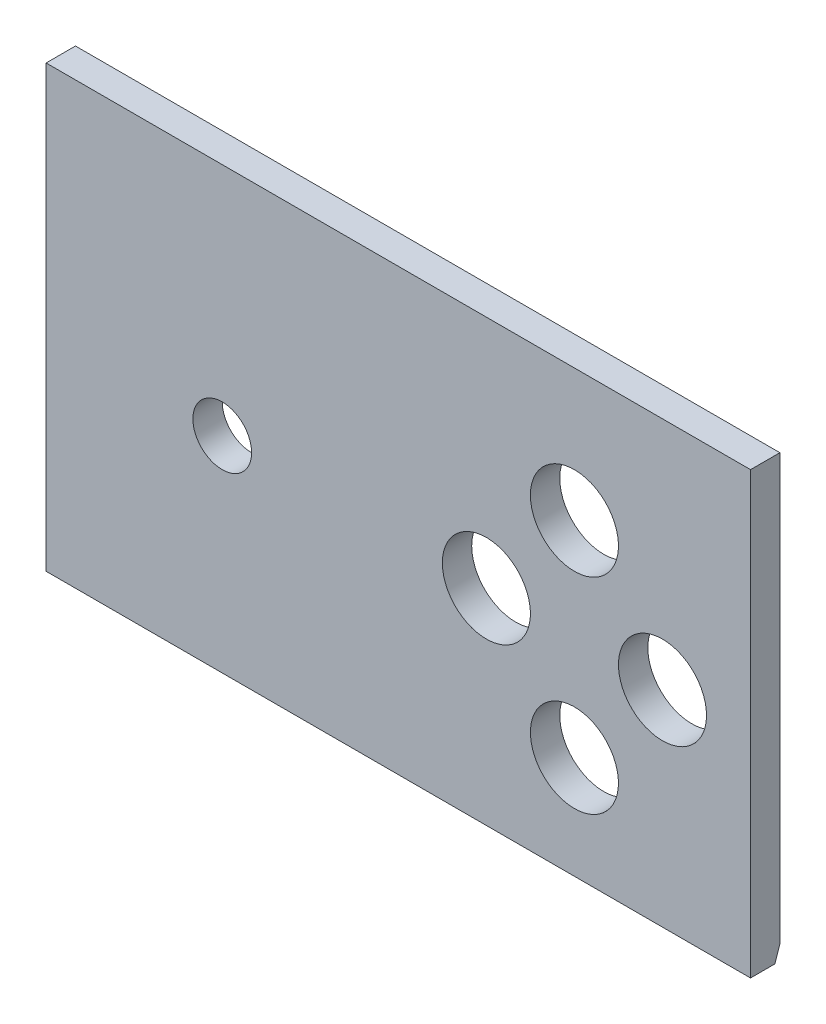
ISO-10303-21;
HEADER;
FILE_DESCRIPTION(('STEP AP214'),'2;1');
FILE_NAME('part.step','',(''),(''),'','','');
FILE_SCHEMA(('AUTOMOTIVE_DESIGN { 1 0 10303 214 1 1 1 1 }'));
ENDSEC;
DATA;
#1=APPLICATION_CONTEXT('core data for automotive mechanical design processes');
#2=APPLICATION_PROTOCOL_DEFINITION('international standard','automotive_design',2000,#1);
#3=PRODUCT_CONTEXT('',#1,'mechanical');
#4=PRODUCT('Part','Part','',(#3));
#5=PRODUCT_RELATED_PRODUCT_CATEGORY('part','',(#4));
#6=PRODUCT_DEFINITION_FORMATION('','',#4);
#7=PRODUCT_DEFINITION_CONTEXT('part definition',#1,'design');
#8=PRODUCT_DEFINITION('design','',#6,#7);
#9=PRODUCT_DEFINITION_SHAPE('','',#8);
#10=(LENGTH_UNIT() NAMED_UNIT(*) SI_UNIT(.MILLI.,.METRE.));
#11=(NAMED_UNIT(*) PLANE_ANGLE_UNIT() SI_UNIT($,.RADIAN.));
#12=(NAMED_UNIT(*) SI_UNIT($,.STERADIAN.) SOLID_ANGLE_UNIT());
#13=UNCERTAINTY_MEASURE_WITH_UNIT(LENGTH_MEASURE(1.E-05),#10,'distance_accuracy_value','');
#14=(GEOMETRIC_REPRESENTATION_CONTEXT(3) GLOBAL_UNCERTAINTY_ASSIGNED_CONTEXT((#13)) GLOBAL_UNIT_ASSIGNED_CONTEXT((#10,
#11,#12)) REPRESENTATION_CONTEXT('',''));
#15=CARTESIAN_POINT('',(0.,0.,0.));
#16=DIRECTION('',(0.,0.,1.));
#17=DIRECTION('',(1.,0.,0.));
#18=AXIS2_PLACEMENT_3D('',#15,#16,#17);
#19=CARTESIAN_POINT('',(0.,0.,10.));
#20=DIRECTION('',(0.,0.,-1.));
#21=DIRECTION('',(-1.,0.,0.));
#22=AXIS2_PLACEMENT_3D('',#19,#20,#21);
#23=PLANE('',#22);
#24=DIRECTION('',(0.,-1.,0.));
#25=VECTOR('',#24,1.);
#26=CARTESIAN_POINT('',(0.,0.,10.));
#27=LINE('',#26,#25);
#28=CARTESIAN_POINT('',(0.,150.,10.));
#29=VERTEX_POINT('',#28);
#30=CARTESIAN_POINT('',(0.,0.,10.));
#31=VERTEX_POINT('',#30);
#32=EDGE_CURVE('E142',#29,#31,#27,.T.);
#33=ORIENTED_EDGE('',*,*,#32,.T.);
#34=DIRECTION('',(1.,0.,0.));
#35=VECTOR('',#34,1.);
#36=CARTESIAN_POINT('',(0.,0.,10.));
#37=LINE('',#36,#35);
#38=CARTESIAN_POINT('',(240.,0.,10.));
#39=VERTEX_POINT('',#38);
#40=EDGE_CURVE('E91',#31,#39,#37,.T.);
#41=ORIENTED_EDGE('',*,*,#40,.T.);
#42=DIRECTION('',(0.,1.,0.));
#43=VECTOR('',#42,1.);
#44=CARTESIAN_POINT('',(240.,0.,10.));
#45=LINE('',#44,#43);
#46=CARTESIAN_POINT('',(240.,150.,10.));
#47=VERTEX_POINT('',#46);
#48=EDGE_CURVE('E154',#39,#47,#45,.T.);
#49=ORIENTED_EDGE('',*,*,#48,.T.);
#50=DIRECTION('',(-1.,0.,0.));
#51=VECTOR('',#50,1.);
#52=CARTESIAN_POINT('',(0.,150.,10.));
#53=LINE('',#52,#51);
#54=EDGE_CURVE('E69',#47,#29,#53,.T.);
#55=ORIENTED_EDGE('',*,*,#54,.T.);
#56=EDGE_LOOP('',(#33,#41,#49,#55));
#57=FACE_BOUND('',#56,.T.);
#58=CARTESIAN_POINT('',(60.,70.,10.));
#59=DIRECTION('',(0.,0.,1.));
#60=DIRECTION('',(1.,0.,0.));
#61=AXIS2_PLACEMENT_3D('',#58,#59,#60);
#62=CIRCLE('',#61,9.99999999999999);
#63=CARTESIAN_POINT('',(70.,70.,10.));
#64=VERTEX_POINT('',#63);
#65=EDGE_CURVE('E129',#64,#64,#62,.T.);
#66=ORIENTED_EDGE('',*,*,#65,.F.);
#67=EDGE_LOOP('',(#66));
#68=FACE_BOUND('',#67,.T.);
#69=CARTESIAN_POINT('',(180.,35.,10.));
#70=DIRECTION('',(0.,0.,1.));
#71=DIRECTION('',(1.,0.,0.));
#72=AXIS2_PLACEMENT_3D('',#69,#70,#71);
#73=CIRCLE('',#72,15.);
#74=CARTESIAN_POINT('',(195.,35.,10.));
#75=VERTEX_POINT('',#74);
#76=EDGE_CURVE('E193',#75,#75,#73,.T.);
#77=ORIENTED_EDGE('',*,*,#76,.F.);
#78=EDGE_LOOP('',(#77));
#79=FACE_BOUND('',#78,.T.);
#80=CARTESIAN_POINT('',(210.,69.9999999999999,10.));
#81=DIRECTION('',(0.,0.,1.));
#82=DIRECTION('',(1.,0.,0.));
#83=AXIS2_PLACEMENT_3D('',#80,#81,#82);
#84=CIRCLE('',#83,15.);
#85=CARTESIAN_POINT('',(225.,69.9999999999999,10.));
#86=VERTEX_POINT('',#85);
#87=EDGE_CURVE('E185',#86,#86,#84,.T.);
#88=ORIENTED_EDGE('',*,*,#87,.F.);
#89=EDGE_LOOP('',(#88));
#90=FACE_BOUND('',#89,.T.);
#91=CARTESIAN_POINT('',(150.,69.9999999999999,10.));
#92=DIRECTION('',(0.,0.,1.));
#93=DIRECTION('',(-1.,0.,0.));
#94=AXIS2_PLACEMENT_3D('',#91,#92,#93);
#95=CIRCLE('',#94,15.);
#96=CARTESIAN_POINT('',(135.,69.9999999999999,10.));
#97=VERTEX_POINT('',#96);
#98=EDGE_CURVE('E177',#97,#97,#95,.T.);
#99=ORIENTED_EDGE('',*,*,#98,.F.);
#100=EDGE_LOOP('',(#99));
#101=FACE_BOUND('',#100,.T.);
#102=CARTESIAN_POINT('',(180.,105.,10.));
#103=DIRECTION('',(0.,0.,1.));
#104=DIRECTION('',(-1.,0.,0.));
#105=AXIS2_PLACEMENT_3D('',#102,#103,#104);
#106=CIRCLE('',#105,15.);
#107=CARTESIAN_POINT('',(165.,105.,10.));
#108=VERTEX_POINT('',#107);
#109=EDGE_CURVE('E166',#108,#108,#106,.T.);
#110=ORIENTED_EDGE('',*,*,#109,.F.);
#111=EDGE_LOOP('',(#110));
#112=FACE_BOUND('',#111,.T.);
#113=ADVANCED_FACE('F44',(#57,#68,#79,#90,#101,#112),#23,.F.);
#114=CARTESIAN_POINT('',(0.,0.,0.));
#115=DIRECTION('',(0.,0.,-1.));
#116=DIRECTION('',(-1.,0.,0.));
#117=AXIS2_PLACEMENT_3D('',#114,#115,#116);
#118=PLANE('',#117);
#119=DIRECTION('',(1.,0.,0.));
#120=VECTOR('',#119,1.);
#121=CARTESIAN_POINT('',(0.,4.93483823285935,0.));
#122=LINE('',#121,#120);
#123=CARTESIAN_POINT('',(0.,4.93483823285935,0.));
#124=VERTEX_POINT('',#123);
#125=CARTESIAN_POINT('',(240.,4.93483823285935,0.));
#126=VERTEX_POINT('',#125);
#127=EDGE_CURVE('E108',#124,#126,#122,.T.);
#128=ORIENTED_EDGE('',*,*,#127,.F.);
#129=DIRECTION('',(0.,-1.,0.));
#130=VECTOR('',#129,1.);
#131=CARTESIAN_POINT('',(0.,0.,0.));
#132=LINE('',#131,#130);
#133=CARTESIAN_POINT('',(0.,150.,0.));
#134=VERTEX_POINT('',#133);
#135=EDGE_CURVE('E121',#134,#124,#132,.T.);
#136=ORIENTED_EDGE('',*,*,#135,.F.);
#137=DIRECTION('',(-1.,0.,0.));
#138=VECTOR('',#137,1.);
#139=CARTESIAN_POINT('',(0.,150.,0.));
#140=LINE('',#139,#138);
#141=CARTESIAN_POINT('',(240.,150.,0.));
#142=VERTEX_POINT('',#141);
#143=EDGE_CURVE('E84',#142,#134,#140,.T.);
#144=ORIENTED_EDGE('',*,*,#143,.F.);
#145=DIRECTION('',(0.,1.,0.));
#146=VECTOR('',#145,1.);
#147=CARTESIAN_POINT('',(240.,0.,0.));
#148=LINE('',#147,#146);
#149=EDGE_CURVE('E122',#126,#142,#148,.T.);
#150=ORIENTED_EDGE('',*,*,#149,.F.);
#151=EDGE_LOOP('',(#128,#136,#144,#150));
#152=FACE_BOUND('',#151,.T.);
#153=CARTESIAN_POINT('',(150.,69.9999999999999,0.));
#154=DIRECTION('',(0.,0.,1.));
#155=DIRECTION('',(-1.,0.,0.));
#156=AXIS2_PLACEMENT_3D('',#153,#154,#155);
#157=CIRCLE('',#156,15.);
#158=CARTESIAN_POINT('',(135.,69.9999999999999,0.));
#159=VERTEX_POINT('',#158);
#160=EDGE_CURVE('E175',#159,#159,#157,.T.);
#161=ORIENTED_EDGE('',*,*,#160,.T.);
#162=EDGE_LOOP('',(#161));
#163=FACE_BOUND('',#162,.T.);
#164=CARTESIAN_POINT('',(180.,35.,0.));
#165=DIRECTION('',(0.,0.,1.));
#166=DIRECTION('',(1.,0.,0.));
#167=AXIS2_PLACEMENT_3D('',#164,#165,#166);
#168=CIRCLE('',#167,15.);
#169=CARTESIAN_POINT('',(195.,35.,0.));
#170=VERTEX_POINT('',#169);
#171=EDGE_CURVE('E189',#170,#170,#168,.T.);
#172=ORIENTED_EDGE('',*,*,#171,.T.);
#173=EDGE_LOOP('',(#172));
#174=FACE_BOUND('',#173,.T.);
#175=CARTESIAN_POINT('',(60.,70.,0.));
#176=DIRECTION('',(0.,0.,1.));
#177=DIRECTION('',(1.,0.,0.));
#178=AXIS2_PLACEMENT_3D('',#175,#176,#177);
#179=CIRCLE('',#178,9.99999999999999);
#180=CARTESIAN_POINT('',(70.,70.,0.));
#181=VERTEX_POINT('',#180);
#182=EDGE_CURVE('E135',#181,#181,#179,.T.);
#183=ORIENTED_EDGE('',*,*,#182,.T.);
#184=EDGE_LOOP('',(#183));
#185=FACE_BOUND('',#184,.T.);
#186=CARTESIAN_POINT('',(210.,69.9999999999999,0.));
#187=DIRECTION('',(0.,0.,1.));
#188=DIRECTION('',(1.,0.,0.));
#189=AXIS2_PLACEMENT_3D('',#186,#187,#188);
#190=CIRCLE('',#189,15.);
#191=CARTESIAN_POINT('',(225.,69.9999999999999,0.));
#192=VERTEX_POINT('',#191);
#193=EDGE_CURVE('E181',#192,#192,#190,.T.);
#194=ORIENTED_EDGE('',*,*,#193,.T.);
#195=EDGE_LOOP('',(#194));
#196=FACE_BOUND('',#195,.T.);
#197=CARTESIAN_POINT('',(180.,105.,0.));
#198=DIRECTION('',(0.,0.,1.));
#199=DIRECTION('',(-1.,0.,0.));
#200=AXIS2_PLACEMENT_3D('',#197,#198,#199);
#201=CIRCLE('',#200,15.);
#202=CARTESIAN_POINT('',(165.,105.,0.));
#203=VERTEX_POINT('',#202);
#204=EDGE_CURVE('E161',#203,#203,#201,.T.);
#205=ORIENTED_EDGE('',*,*,#204,.T.);
#206=EDGE_LOOP('',(#205));
#207=FACE_BOUND('',#206,.T.);
#208=ADVANCED_FACE('F119',(#152,#163,#174,#185,#196,#207),#118,.T.);
#209=CARTESIAN_POINT('',(0.,0.,10.));
#210=DIRECTION('',(1.,0.,0.));
#211=DIRECTION('',(0.,0.,-1.));
#212=AXIS2_PLACEMENT_3D('',#209,#210,#211);
#213=PLANE('',#212);
#214=ORIENTED_EDGE('',*,*,#135,.T.);
#215=DIRECTION('',(0.,0.31732249287703,0.948317687019655));
#216=VECTOR('',#215,1.);
#217=CARTESIAN_POINT('',(0.,4.94338102164418,0.0255301085897667));
#218=LINE('',#217,#216);
#219=CARTESIAN_POINT('',(0.,4.94338102164418,0.0255301085897667));
#220=VERTEX_POINT('',#219);
#221=EDGE_CURVE('E105',#124,#220,#218,.T.);
#222=ORIENTED_EDGE('',*,*,#221,.T.);
#223=DIRECTION('',(0.,-0.948317687019718,0.317322492876841));
#224=VECTOR('',#223,1.);
#225=CARTESIAN_POINT('',(0.,4.94338102164418,0.025530108589765));
#226=LINE('',#225,#224);
#227=CARTESIAN_POINT('',(0.,0.,1.67966564829269));
#228=VERTEX_POINT('',#227);
#229=EDGE_CURVE('E168',#220,#228,#226,.T.);
#230=ORIENTED_EDGE('',*,*,#229,.T.);
#231=DIRECTION('',(0.,0.,-1.));
#232=VECTOR('',#231,1.);
#233=CARTESIAN_POINT('',(0.,0.,10.));
#234=LINE('',#233,#232);
#235=EDGE_CURVE('E11',#31,#228,#234,.T.);
#236=ORIENTED_EDGE('',*,*,#235,.F.);
#237=ORIENTED_EDGE('',*,*,#32,.F.);
#238=DIRECTION('',(0.,0.,-1.));
#239=VECTOR('',#238,1.);
#240=CARTESIAN_POINT('',(0.,150.,10.));
#241=LINE('',#240,#239);
#242=EDGE_CURVE('E127',#29,#134,#241,.T.);
#243=ORIENTED_EDGE('',*,*,#242,.T.);
#244=EDGE_LOOP('',(#214,#222,#230,#236,#237,#243));
#245=FACE_BOUND('',#244,.T.);
#246=ADVANCED_FACE('F46',(#245),#213,.F.);
#247=CARTESIAN_POINT('',(0.,0.,10.));
#248=DIRECTION('',(0.,1.,0.));
#249=DIRECTION('',(0.,0.,1.));
#250=AXIS2_PLACEMENT_3D('',#247,#248,#249);
#251=PLANE('',#250);
#252=ORIENTED_EDGE('',*,*,#235,.T.);
#253=DIRECTION('',(1.,0.,0.));
#254=VECTOR('',#253,1.);
#255=CARTESIAN_POINT('',(0.,0.,1.67966564829269));
#256=LINE('',#255,#254);
#257=CARTESIAN_POINT('',(240.,0.,1.67966564829269));
#258=VERTEX_POINT('',#257);
#259=EDGE_CURVE('E157',#228,#258,#256,.T.);
#260=ORIENTED_EDGE('',*,*,#259,.T.);
#261=DIRECTION('',(0.,0.,-1.));
#262=VECTOR('',#261,1.);
#263=CARTESIAN_POINT('',(240.,0.,10.));
#264=LINE('',#263,#262);
#265=EDGE_CURVE('E53',#39,#258,#264,.T.);
#266=ORIENTED_EDGE('',*,*,#265,.F.);
#267=ORIENTED_EDGE('',*,*,#40,.F.);
#268=EDGE_LOOP('',(#252,#260,#266,#267));
#269=FACE_BOUND('',#268,.T.);
#270=ADVANCED_FACE('F156',(#269),#251,.F.);
#271=CARTESIAN_POINT('',(240.,0.,10.));
#272=DIRECTION('',(-1.,0.,0.));
#273=DIRECTION('',(0.,0.,1.));
#274=AXIS2_PLACEMENT_3D('',#271,#272,#273);
#275=PLANE('',#274);
#276=DIRECTION('',(0.,-0.948317687019718,0.317322492876841));
#277=VECTOR('',#276,1.);
#278=CARTESIAN_POINT('',(240.,4.94338102164418,0.025530108589765));
#279=LINE('',#278,#277);
#280=CARTESIAN_POINT('',(240.,4.94338102164418,0.0255301085897667));
#281=VERTEX_POINT('',#280);
#282=EDGE_CURVE('E124',#281,#258,#279,.T.);
#283=ORIENTED_EDGE('',*,*,#282,.F.);
#284=DIRECTION('',(0.,0.31732249287703,0.948317687019655));
#285=VECTOR('',#284,1.);
#286=CARTESIAN_POINT('',(240.,4.94338102164418,0.0255301085897667));
#287=LINE('',#286,#285);
#288=EDGE_CURVE('E60',#126,#281,#287,.T.);
#289=ORIENTED_EDGE('',*,*,#288,.F.);
#290=ORIENTED_EDGE('',*,*,#149,.T.);
#291=DIRECTION('',(0.,0.,-1.));
#292=VECTOR('',#291,1.);
#293=CARTESIAN_POINT('',(240.,150.,10.));
#294=LINE('',#293,#292);
#295=EDGE_CURVE('E145',#47,#142,#294,.T.);
#296=ORIENTED_EDGE('',*,*,#295,.F.);
#297=ORIENTED_EDGE('',*,*,#48,.F.);
#298=ORIENTED_EDGE('',*,*,#265,.T.);
#299=EDGE_LOOP('',(#283,#289,#290,#296,#297,#298));
#300=FACE_BOUND('',#299,.T.);
#301=ADVANCED_FACE('F152',(#300),#275,.F.);
#302=CARTESIAN_POINT('',(0.,150.,10.));
#303=DIRECTION('',(0.,-1.,0.));
#304=DIRECTION('',(0.,0.,-1.));
#305=AXIS2_PLACEMENT_3D('',#302,#303,#304);
#306=PLANE('',#305);
#307=ORIENTED_EDGE('',*,*,#143,.T.);
#308=ORIENTED_EDGE('',*,*,#242,.F.);
#309=ORIENTED_EDGE('',*,*,#54,.F.);
#310=ORIENTED_EDGE('',*,*,#295,.T.);
#311=EDGE_LOOP('',(#307,#308,#309,#310));
#312=FACE_BOUND('',#311,.T.);
#313=ADVANCED_FACE('F209',(#312),#306,.F.);
#314=CARTESIAN_POINT('',(60.,70.,10.));
#315=DIRECTION('',(0.,0.,-1.));
#316=DIRECTION('',(-1.,0.,0.));
#317=AXIS2_PLACEMENT_3D('',#314,#315,#316);
#318=CYLINDRICAL_SURFACE('',#317,9.99999999999999);
#319=ORIENTED_EDGE('',*,*,#65,.T.);
#320=EDGE_LOOP('',(#319));
#321=FACE_BOUND('',#320,.T.);
#322=ORIENTED_EDGE('',*,*,#182,.F.);
#323=EDGE_LOOP('',(#322));
#324=FACE_BOUND('',#323,.T.);
#325=ADVANCED_FACE('F235',(#321,#324),#318,.F.);
#326=CARTESIAN_POINT('',(180.,35.,10.));
#327=DIRECTION('',(0.,0.,-1.));
#328=DIRECTION('',(-1.,0.,0.));
#329=AXIS2_PLACEMENT_3D('',#326,#327,#328);
#330=CYLINDRICAL_SURFACE('',#329,15.);
#331=ORIENTED_EDGE('',*,*,#76,.T.);
#332=EDGE_LOOP('',(#331));
#333=FACE_BOUND('',#332,.T.);
#334=ORIENTED_EDGE('',*,*,#171,.F.);
#335=EDGE_LOOP('',(#334));
#336=FACE_BOUND('',#335,.T.);
#337=ADVANCED_FACE('F271',(#333,#336),#330,.F.);
#338=CARTESIAN_POINT('',(210.,69.9999999999999,10.));
#339=DIRECTION('',(0.,0.,-1.));
#340=DIRECTION('',(-1.,0.,0.));
#341=AXIS2_PLACEMENT_3D('',#338,#339,#340);
#342=CYLINDRICAL_SURFACE('',#341,15.);
#343=ORIENTED_EDGE('',*,*,#87,.T.);
#344=EDGE_LOOP('',(#343));
#345=FACE_BOUND('',#344,.T.);
#346=ORIENTED_EDGE('',*,*,#193,.F.);
#347=EDGE_LOOP('',(#346));
#348=FACE_BOUND('',#347,.T.);
#349=ADVANCED_FACE('F280',(#345,#348),#342,.F.);
#350=CARTESIAN_POINT('',(150.,69.9999999999999,10.));
#351=DIRECTION('',(0.,0.,-1.));
#352=DIRECTION('',(-1.,0.,0.));
#353=AXIS2_PLACEMENT_3D('',#350,#351,#352);
#354=CYLINDRICAL_SURFACE('',#353,15.);
#355=ORIENTED_EDGE('',*,*,#98,.T.);
#356=EDGE_LOOP('',(#355));
#357=FACE_BOUND('',#356,.T.);
#358=ORIENTED_EDGE('',*,*,#160,.F.);
#359=EDGE_LOOP('',(#358));
#360=FACE_BOUND('',#359,.T.);
#361=ADVANCED_FACE('F224',(#357,#360),#354,.F.);
#362=CARTESIAN_POINT('',(180.,105.,10.));
#363=DIRECTION('',(0.,0.,-1.));
#364=DIRECTION('',(-1.,0.,0.));
#365=AXIS2_PLACEMENT_3D('',#362,#363,#364);
#366=CYLINDRICAL_SURFACE('',#365,15.);
#367=ORIENTED_EDGE('',*,*,#109,.T.);
#368=EDGE_LOOP('',(#367));
#369=FACE_BOUND('',#368,.T.);
#370=ORIENTED_EDGE('',*,*,#204,.F.);
#371=EDGE_LOOP('',(#370));
#372=FACE_BOUND('',#371,.T.);
#373=ADVANCED_FACE('F216',(#369,#372),#366,.F.);
#374=CARTESIAN_POINT('',(0.,4.94338102164418,0.025530108589765));
#375=DIRECTION('',(0.,0.317322492876841,0.948317687019718));
#376=DIRECTION('',(0.,-0.948317687019718,0.317322492876841));
#377=AXIS2_PLACEMENT_3D('',#374,#375,#376);
#378=PLANE('',#377);
#379=ORIENTED_EDGE('',*,*,#282,.T.);
#380=ORIENTED_EDGE('',*,*,#259,.F.);
#381=ORIENTED_EDGE('',*,*,#229,.F.);
#382=DIRECTION('',(1.,0.,0.));
#383=VECTOR('',#382,1.);
#384=CARTESIAN_POINT('',(0.,4.94338102164418,0.025530108589765));
#385=LINE('',#384,#383);
#386=EDGE_CURVE('E109',#220,#281,#385,.T.);
#387=ORIENTED_EDGE('',*,*,#386,.T.);
#388=EDGE_LOOP('',(#379,#380,#381,#387));
#389=FACE_BOUND('',#388,.T.);
#390=ADVANCED_FACE('F214',(#389),#378,.F.);
#391=CARTESIAN_POINT('',(0.,4.94338102164418,0.0255301085897667));
#392=DIRECTION('',(0.,0.948317687019655,-0.31732249287703));
#393=DIRECTION('',(0.,0.31732249287703,0.948317687019655));
#394=AXIS2_PLACEMENT_3D('',#391,#392,#393);
#395=PLANE('',#394);
#396=ORIENTED_EDGE('',*,*,#288,.T.);
#397=ORIENTED_EDGE('',*,*,#386,.F.);
#398=ORIENTED_EDGE('',*,*,#221,.F.);
#399=ORIENTED_EDGE('',*,*,#127,.T.);
#400=EDGE_LOOP('',(#396,#397,#398,#399));
#401=FACE_BOUND('',#400,.T.);
#402=ADVANCED_FACE('F107',(#401),#395,.F.);
#403=CLOSED_SHELL('',(#113,#208,#246,#270,#301,#313,#325,#337,#349,#361,#373,#390,#402));
#404=MANIFOLD_SOLID_BREP('B2',#403);
#405=ADVANCED_BREP_SHAPE_REPRESENTATION('',(#18,#404),#14);
#406=SHAPE_DEFINITION_REPRESENTATION(#9,#405);
ENDSEC;
END-ISO-10303-21;
